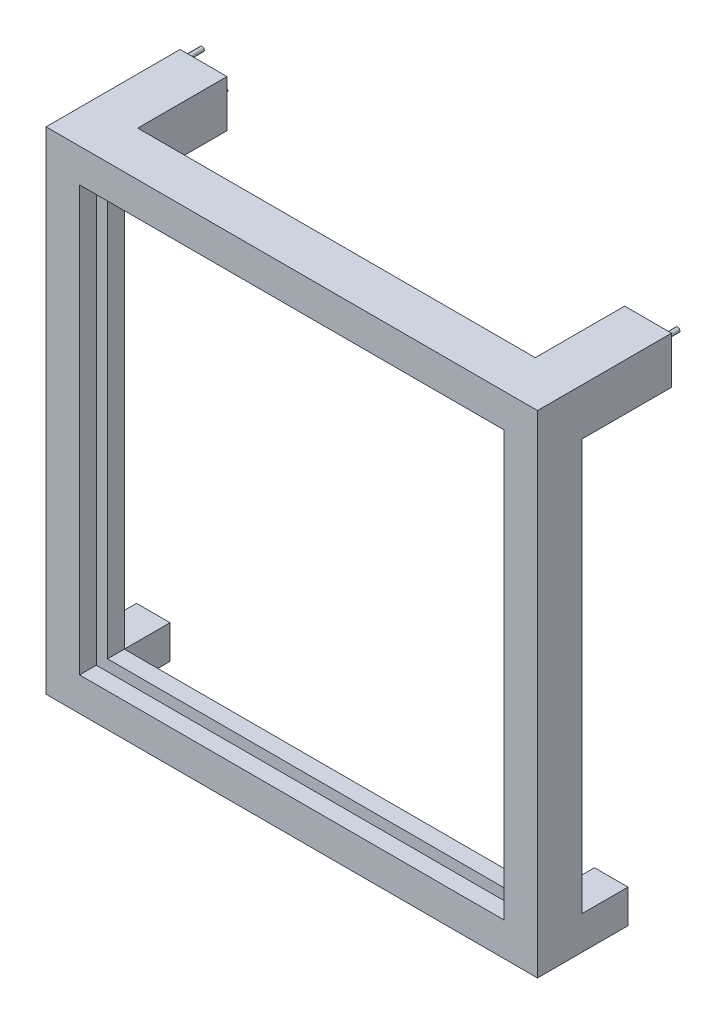
ISO-10303-21;
HEADER;
FILE_DESCRIPTION(('STEP AP214'),'2;1');
FILE_NAME('part.step','',(''),(''),'','','');
FILE_SCHEMA(('AUTOMOTIVE_DESIGN { 1 0 10303 214 1 1 1 1 }'));
ENDSEC;
DATA;
#1=APPLICATION_CONTEXT('core data for automotive mechanical design processes');
#2=APPLICATION_PROTOCOL_DEFINITION('international standard','automotive_design',2000,#1);
#3=PRODUCT_CONTEXT('',#1,'mechanical');
#4=PRODUCT('Part','Part','',(#3));
#5=PRODUCT_RELATED_PRODUCT_CATEGORY('part','',(#4));
#6=PRODUCT_DEFINITION_FORMATION('','',#4);
#7=PRODUCT_DEFINITION_CONTEXT('part definition',#1,'design');
#8=PRODUCT_DEFINITION('design','',#6,#7);
#9=PRODUCT_DEFINITION_SHAPE('','',#8);
#10=(LENGTH_UNIT() NAMED_UNIT(*) SI_UNIT(.MILLI.,.METRE.));
#11=(NAMED_UNIT(*) PLANE_ANGLE_UNIT() SI_UNIT($,.RADIAN.));
#12=(NAMED_UNIT(*) SI_UNIT($,.STERADIAN.) SOLID_ANGLE_UNIT());
#13=UNCERTAINTY_MEASURE_WITH_UNIT(LENGTH_MEASURE(1.E-05),#10,'distance_accuracy_value','');
#14=(GEOMETRIC_REPRESENTATION_CONTEXT(3) GLOBAL_UNCERTAINTY_ASSIGNED_CONTEXT((#13)) GLOBAL_UNIT_ASSIGNED_CONTEXT((#10,
#11,#12)) REPRESENTATION_CONTEXT('',''));
#15=CARTESIAN_POINT('',(0.,0.,0.));
#16=DIRECTION('',(0.,0.,1.));
#17=DIRECTION('',(1.,0.,0.));
#18=AXIS2_PLACEMENT_3D('',#15,#16,#17);
#19=CARTESIAN_POINT('',(0.,0.,0.));
#20=DIRECTION('',(0.,0.,-1.));
#21=DIRECTION('',(-1.,0.,0.));
#22=AXIS2_PLACEMENT_3D('',#19,#20,#21);
#23=PLANE('',#22);
#24=DIRECTION('',(1.,0.,0.));
#25=VECTOR('',#24,1.);
#26=CARTESIAN_POINT('',(-220.,-220.,0.));
#27=LINE('',#26,#25);
#28=CARTESIAN_POINT('',(-190.,-220.,0.));
#29=VERTEX_POINT('',#28);
#30=CARTESIAN_POINT('',(190.,-220.,0.));
#31=VERTEX_POINT('',#30);
#32=EDGE_CURVE('E254',#29,#31,#27,.T.);
#33=ORIENTED_EDGE('',*,*,#32,.F.);
#34=DIRECTION('',(0.,-1.,0.));
#35=VECTOR('',#34,1.);
#36=CARTESIAN_POINT('',(-190.,-190.,0.));
#37=LINE('',#36,#35);
#38=CARTESIAN_POINT('',(-190.,-190.,0.));
#39=VERTEX_POINT('',#38);
#40=EDGE_CURVE('E52',#39,#29,#37,.T.);
#41=ORIENTED_EDGE('',*,*,#40,.F.);
#42=DIRECTION('',(1.,0.,0.));
#43=VECTOR('',#42,1.);
#44=CARTESIAN_POINT('',(-190.,-190.,0.));
#45=LINE('',#44,#43);
#46=CARTESIAN_POINT('',(190.,-190.,0.));
#47=VERTEX_POINT('',#46);
#48=EDGE_CURVE('E253',#39,#47,#45,.T.);
#49=ORIENTED_EDGE('',*,*,#48,.T.);
#50=DIRECTION('',(0.,1.,0.));
#51=VECTOR('',#50,1.);
#52=CARTESIAN_POINT('',(190.,-220.,0.));
#53=LINE('',#52,#51);
#54=EDGE_CURVE('E255',#31,#47,#53,.T.);
#55=ORIENTED_EDGE('',*,*,#54,.F.);
#56=EDGE_LOOP('',(#33,#41,#49,#55));
#57=FACE_BOUND('',#56,.T.);
#58=ADVANCED_FACE('F37',(#57),#23,.T.);
#59=DIRECTION('',(0.,-1.,0.));
#60=VECTOR('',#59,1.);
#61=CARTESIAN_POINT('',(-190.,-190.,0.));
#62=LINE('',#61,#60);
#63=CARTESIAN_POINT('',(-190.,178.,0.));
#64=VERTEX_POINT('',#63);
#65=EDGE_CURVE('E259',#64,#39,#62,.T.);
#66=ORIENTED_EDGE('',*,*,#65,.T.);
#67=DIRECTION('',(1.,0.,0.));
#68=VECTOR('',#67,1.);
#69=CARTESIAN_POINT('',(-190.,-190.,0.));
#70=LINE('',#69,#68);
#71=CARTESIAN_POINT('',(-220.,-190.,0.));
#72=VERTEX_POINT('',#71);
#73=EDGE_CURVE('E232',#72,#39,#70,.T.);
#74=ORIENTED_EDGE('',*,*,#73,.F.);
#75=DIRECTION('',(0.,-1.,0.));
#76=VECTOR('',#75,1.);
#77=CARTESIAN_POINT('',(-220.,-220.,0.));
#78=LINE('',#77,#76);
#79=CARTESIAN_POINT('',(-220.,178.,0.));
#80=VERTEX_POINT('',#79);
#81=EDGE_CURVE('E316',#80,#72,#78,.T.);
#82=ORIENTED_EDGE('',*,*,#81,.F.);
#83=DIRECTION('',(-1.,0.,0.));
#84=VECTOR('',#83,1.);
#85=CARTESIAN_POINT('',(-220.,178.,0.));
#86=LINE('',#85,#84);
#87=EDGE_CURVE('E262',#64,#80,#86,.T.);
#88=ORIENTED_EDGE('',*,*,#87,.F.);
#89=EDGE_LOOP('',(#66,#74,#82,#88));
#90=FACE_BOUND('',#89,.T.);
#91=ADVANCED_FACE('F261',(#90),#23,.T.);
#92=DIRECTION('',(0.,1.,0.));
#93=VECTOR('',#92,1.);
#94=CARTESIAN_POINT('',(220.,-220.,0.));
#95=LINE('',#94,#93);
#96=CARTESIAN_POINT('',(220.,-190.,0.));
#97=VERTEX_POINT('',#96);
#98=CARTESIAN_POINT('',(220.,178.,0.));
#99=VERTEX_POINT('',#98);
#100=EDGE_CURVE('E301',#97,#99,#95,.T.);
#101=ORIENTED_EDGE('',*,*,#100,.F.);
#102=DIRECTION('',(1.,0.,0.));
#103=VECTOR('',#102,1.);
#104=CARTESIAN_POINT('',(220.,-190.,0.));
#105=LINE('',#104,#103);
#106=EDGE_CURVE('E426',#47,#97,#105,.T.);
#107=ORIENTED_EDGE('',*,*,#106,.F.);
#108=DIRECTION('',(0.,1.,0.));
#109=VECTOR('',#108,1.);
#110=CARTESIAN_POINT('',(190.,-190.,0.));
#111=LINE('',#110,#109);
#112=CARTESIAN_POINT('',(190.,178.,0.));
#113=VERTEX_POINT('',#112);
#114=EDGE_CURVE('E495',#47,#113,#111,.T.);
#115=ORIENTED_EDGE('',*,*,#114,.T.);
#116=DIRECTION('',(-1.,0.,0.));
#117=VECTOR('',#116,1.);
#118=CARTESIAN_POINT('',(220.,178.,0.));
#119=LINE('',#118,#117);
#120=EDGE_CURVE('E343',#99,#113,#119,.T.);
#121=ORIENTED_EDGE('',*,*,#120,.F.);
#122=EDGE_LOOP('',(#101,#107,#115,#121));
#123=FACE_BOUND('',#122,.T.);
#124=ADVANCED_FACE('F474',(#123),#23,.T.);
#125=DIRECTION('',(-1.,0.,0.));
#126=VECTOR('',#125,1.);
#127=CARTESIAN_POINT('',(-190.,190.,0.));
#128=LINE('',#127,#126);
#129=CARTESIAN_POINT('',(178.,190.,0.));
#130=VERTEX_POINT('',#129);
#131=CARTESIAN_POINT('',(-178.,190.,0.));
#132=VERTEX_POINT('',#131);
#133=EDGE_CURVE('E490',#130,#132,#128,.T.);
#134=ORIENTED_EDGE('',*,*,#133,.T.);
#135=DIRECTION('',(0.,-1.,0.));
#136=VECTOR('',#135,1.);
#137=CARTESIAN_POINT('',(-178.,220.,0.));
#138=LINE('',#137,#136);
#139=CARTESIAN_POINT('',(-178.,220.,0.));
#140=VERTEX_POINT('',#139);
#141=EDGE_CURVE('E364',#140,#132,#138,.T.);
#142=ORIENTED_EDGE('',*,*,#141,.F.);
#143=DIRECTION('',(-1.,0.,0.));
#144=VECTOR('',#143,1.);
#145=CARTESIAN_POINT('',(-220.,220.,0.));
#146=LINE('',#145,#144);
#147=CARTESIAN_POINT('',(178.,220.,0.));
#148=VERTEX_POINT('',#147);
#149=EDGE_CURVE('E313',#148,#140,#146,.T.);
#150=ORIENTED_EDGE('',*,*,#149,.F.);
#151=DIRECTION('',(0.,1.,0.));
#152=VECTOR('',#151,1.);
#153=CARTESIAN_POINT('',(178.,220.,0.));
#154=LINE('',#153,#152);
#155=EDGE_CURVE('E329',#130,#148,#154,.T.);
#156=ORIENTED_EDGE('',*,*,#155,.F.);
#157=EDGE_LOOP('',(#134,#142,#150,#156));
#158=FACE_BOUND('',#157,.T.);
#159=ADVANCED_FACE('F470',(#158),#23,.T.);
#160=CARTESIAN_POINT('',(190.,-190.,40.));
#161=DIRECTION('',(-1.,0.,0.));
#162=DIRECTION('',(0.,0.,1.));
#163=AXIS2_PLACEMENT_3D('',#160,#161,#162);
#164=PLANE('',#163);
#165=DIRECTION('',(0.,-1.,0.));
#166=VECTOR('',#165,1.);
#167=CARTESIAN_POINT('',(190.,-190.,15.));
#168=LINE('',#167,#166);
#169=CARTESIAN_POINT('',(190.,190.,15.));
#170=VERTEX_POINT('',#169);
#171=CARTESIAN_POINT('',(190.,-190.,15.));
#172=VERTEX_POINT('',#171);
#173=EDGE_CURVE('E505',#170,#172,#168,.T.);
#174=ORIENTED_EDGE('',*,*,#173,.F.);
#175=DIRECTION('',(0.,0.,-1.));
#176=VECTOR('',#175,1.);
#177=CARTESIAN_POINT('',(190.,190.,40.));
#178=LINE('',#177,#176);
#179=CARTESIAN_POINT('',(190.,190.,0.));
#180=VERTEX_POINT('',#179);
#181=EDGE_CURVE('E297',#170,#180,#178,.T.);
#182=ORIENTED_EDGE('',*,*,#181,.T.);
#183=EDGE_CURVE('E496',#113,#180,#111,.T.);
#184=ORIENTED_EDGE('',*,*,#183,.F.);
#185=ORIENTED_EDGE('',*,*,#114,.F.);
#186=DIRECTION('',(0.,0.,-1.));
#187=VECTOR('',#186,1.);
#188=CARTESIAN_POINT('',(190.,-190.,40.));
#189=LINE('',#188,#187);
#190=EDGE_CURVE('E282',#172,#47,#189,.T.);
#191=ORIENTED_EDGE('',*,*,#190,.F.);
#192=EDGE_LOOP('',(#174,#182,#184,#185,#191));
#193=FACE_BOUND('',#192,.T.);
#194=ADVANCED_FACE('F477',(#193),#164,.T.);
#195=CARTESIAN_POINT('',(-190.,190.,40.));
#196=DIRECTION('',(0.,-1.,0.));
#197=DIRECTION('',(0.,0.,-1.));
#198=AXIS2_PLACEMENT_3D('',#195,#196,#197);
#199=PLANE('',#198);
#200=DIRECTION('',(1.,0.,0.));
#201=VECTOR('',#200,1.);
#202=CARTESIAN_POINT('',(-190.,190.,15.));
#203=LINE('',#202,#201);
#204=CARTESIAN_POINT('',(-190.,190.,15.));
#205=VERTEX_POINT('',#204);
#206=EDGE_CURVE('E507',#205,#170,#203,.T.);
#207=ORIENTED_EDGE('',*,*,#206,.F.);
#208=DIRECTION('',(0.,0.,-1.));
#209=VECTOR('',#208,1.);
#210=CARTESIAN_POINT('',(-190.,190.,40.));
#211=LINE('',#210,#209);
#212=CARTESIAN_POINT('',(-190.,190.,0.));
#213=VERTEX_POINT('',#212);
#214=EDGE_CURVE('E293',#205,#213,#211,.T.);
#215=ORIENTED_EDGE('',*,*,#214,.T.);
#216=DIRECTION('',(-1.,0.,0.));
#217=VECTOR('',#216,1.);
#218=CARTESIAN_POINT('',(-190.,190.,0.));
#219=LINE('',#218,#217);
#220=EDGE_CURVE('E354',#132,#213,#219,.T.);
#221=ORIENTED_EDGE('',*,*,#220,.F.);
#222=ORIENTED_EDGE('',*,*,#133,.F.);
#223=EDGE_CURVE('E266',#180,#130,#128,.T.);
#224=ORIENTED_EDGE('',*,*,#223,.F.);
#225=ORIENTED_EDGE('',*,*,#181,.F.);
#226=EDGE_LOOP('',(#207,#215,#221,#222,#224,#225));
#227=FACE_BOUND('',#226,.T.);
#228=ADVANCED_FACE('F483',(#227),#199,.T.);
#229=CARTESIAN_POINT('',(-190.,-190.,40.));
#230=DIRECTION('',(1.,0.,0.));
#231=DIRECTION('',(0.,0.,-1.));
#232=AXIS2_PLACEMENT_3D('',#229,#230,#231);
#233=PLANE('',#232);
#234=DIRECTION('',(0.,1.,0.));
#235=VECTOR('',#234,1.);
#236=CARTESIAN_POINT('',(-190.,-190.,15.));
#237=LINE('',#236,#235);
#238=CARTESIAN_POINT('',(-190.,-190.,15.));
#239=VERTEX_POINT('',#238);
#240=EDGE_CURVE('E273',#239,#205,#237,.T.);
#241=ORIENTED_EDGE('',*,*,#240,.F.);
#242=DIRECTION('',(0.,0.,-1.));
#243=VECTOR('',#242,1.);
#244=CARTESIAN_POINT('',(-190.,-190.,40.));
#245=LINE('',#244,#243);
#246=EDGE_CURVE('E270',#239,#39,#245,.T.);
#247=ORIENTED_EDGE('',*,*,#246,.T.);
#248=ORIENTED_EDGE('',*,*,#65,.F.);
#249=EDGE_CURVE('E265',#213,#64,#62,.T.);
#250=ORIENTED_EDGE('',*,*,#249,.F.);
#251=ORIENTED_EDGE('',*,*,#214,.F.);
#252=EDGE_LOOP('',(#241,#247,#248,#250,#251));
#253=FACE_BOUND('',#252,.T.);
#254=ADVANCED_FACE('F271',(#253),#233,.T.);
#255=CARTESIAN_POINT('',(-190.,-190.,40.));
#256=DIRECTION('',(0.,1.,0.));
#257=DIRECTION('',(0.,0.,1.));
#258=AXIS2_PLACEMENT_3D('',#255,#256,#257);
#259=PLANE('',#258);
#260=DIRECTION('',(-1.,0.,0.));
#261=VECTOR('',#260,1.);
#262=CARTESIAN_POINT('',(-190.,-190.,15.));
#263=LINE('',#262,#261);
#264=EDGE_CURVE('E328',#172,#239,#263,.T.);
#265=ORIENTED_EDGE('',*,*,#264,.F.);
#266=ORIENTED_EDGE('',*,*,#190,.T.);
#267=ORIENTED_EDGE('',*,*,#48,.F.);
#268=ORIENTED_EDGE('',*,*,#246,.F.);
#269=EDGE_LOOP('',(#265,#266,#267,#268));
#270=FACE_BOUND('',#269,.T.);
#271=ADVANCED_FACE('F280',(#270),#259,.T.);
#272=CARTESIAN_POINT('',(0.,0.,40.));
#273=DIRECTION('',(0.,0.,-1.));
#274=DIRECTION('',(-1.,0.,0.));
#275=AXIS2_PLACEMENT_3D('',#272,#273,#274);
#276=PLANE('',#275);
#277=DIRECTION('',(0.,1.,0.));
#278=VECTOR('',#277,1.);
#279=CARTESIAN_POINT('',(220.,-220.,40.));
#280=LINE('',#279,#278);
#281=CARTESIAN_POINT('',(220.,-220.,40.));
#282=VERTEX_POINT('',#281);
#283=CARTESIAN_POINT('',(220.,220.,40.));
#284=VERTEX_POINT('',#283);
#285=EDGE_CURVE('E302',#282,#284,#280,.T.);
#286=ORIENTED_EDGE('',*,*,#285,.T.);
#287=DIRECTION('',(-1.,0.,0.));
#288=VECTOR('',#287,1.);
#289=CARTESIAN_POINT('',(-220.,220.,40.));
#290=LINE('',#289,#288);
#291=CARTESIAN_POINT('',(-220.,220.,40.));
#292=VERTEX_POINT('',#291);
#293=EDGE_CURVE('E305',#284,#292,#290,.T.);
#294=ORIENTED_EDGE('',*,*,#293,.T.);
#295=DIRECTION('',(0.,-1.,0.));
#296=VECTOR('',#295,1.);
#297=CARTESIAN_POINT('',(-220.,-220.,40.));
#298=LINE('',#297,#296);
#299=CARTESIAN_POINT('',(-220.,-220.,40.));
#300=VERTEX_POINT('',#299);
#301=EDGE_CURVE('E307',#292,#300,#298,.T.);
#302=ORIENTED_EDGE('',*,*,#301,.T.);
#303=DIRECTION('',(1.,0.,0.));
#304=VECTOR('',#303,1.);
#305=CARTESIAN_POINT('',(-220.,-220.,40.));
#306=LINE('',#305,#304);
#307=EDGE_CURVE('E309',#300,#282,#306,.T.);
#308=ORIENTED_EDGE('',*,*,#307,.T.);
#309=EDGE_LOOP('',(#286,#294,#302,#308));
#310=FACE_BOUND('',#309,.T.);
#311=DIRECTION('',(0.,1.,0.));
#312=VECTOR('',#311,1.);
#313=CARTESIAN_POINT('',(190.,-190.,40.));
#314=LINE('',#313,#312);
#315=CARTESIAN_POINT('',(190.,-190.,40.));
#316=VERTEX_POINT('',#315);
#317=CARTESIAN_POINT('',(190.,190.,40.));
#318=VERTEX_POINT('',#317);
#319=EDGE_CURVE('E284',#316,#318,#314,.T.);
#320=ORIENTED_EDGE('',*,*,#319,.F.);
#321=DIRECTION('',(1.,0.,0.));
#322=VECTOR('',#321,1.);
#323=CARTESIAN_POINT('',(-190.,-190.,40.));
#324=LINE('',#323,#322);
#325=CARTESIAN_POINT('',(-190.,-190.,40.));
#326=VERTEX_POINT('',#325);
#327=EDGE_CURVE('E499',#326,#316,#324,.T.);
#328=ORIENTED_EDGE('',*,*,#327,.F.);
#329=DIRECTION('',(0.,-1.,0.));
#330=VECTOR('',#329,1.);
#331=CARTESIAN_POINT('',(-190.,-190.,40.));
#332=LINE('',#331,#330);
#333=CARTESIAN_POINT('',(-190.,190.,40.));
#334=VERTEX_POINT('',#333);
#335=EDGE_CURVE('E501',#334,#326,#332,.T.);
#336=ORIENTED_EDGE('',*,*,#335,.F.);
#337=DIRECTION('',(-1.,0.,0.));
#338=VECTOR('',#337,1.);
#339=CARTESIAN_POINT('',(-190.,190.,40.));
#340=LINE('',#339,#338);
#341=EDGE_CURVE('E286',#318,#334,#340,.T.);
#342=ORIENTED_EDGE('',*,*,#341,.F.);
#343=EDGE_LOOP('',(#320,#328,#336,#342));
#344=FACE_BOUND('',#343,.T.);
#345=ADVANCED_FACE('F618',(#310,#344),#276,.F.);
#346=CARTESIAN_POINT('',(220.,-220.,40.));
#347=DIRECTION('',(-1.,0.,0.));
#348=DIRECTION('',(0.,0.,1.));
#349=AXIS2_PLACEMENT_3D('',#346,#347,#348);
#350=PLANE('',#349);
#351=DIRECTION('',(0.,0.,-1.));
#352=VECTOR('',#351,1.);
#353=CARTESIAN_POINT('',(220.,-220.,40.));
#354=LINE('',#353,#352);
#355=CARTESIAN_POINT('',(220.,-220.,-41.));
#356=VERTEX_POINT('',#355);
#357=EDGE_CURVE('E311',#282,#356,#354,.T.);
#358=ORIENTED_EDGE('',*,*,#357,.T.);
#359=DIRECTION('',(0.,-1.,0.));
#360=VECTOR('',#359,1.);
#361=CARTESIAN_POINT('',(220.,-220.,-41.));
#362=LINE('',#361,#360);
#363=CARTESIAN_POINT('',(220.,-190.,-41.));
#364=VERTEX_POINT('',#363);
#365=EDGE_CURVE('E428',#364,#356,#362,.T.);
#366=ORIENTED_EDGE('',*,*,#365,.F.);
#367=DIRECTION('',(0.,0.,1.));
#368=VECTOR('',#367,1.);
#369=CARTESIAN_POINT('',(220.,-190.,-41.));
#370=LINE('',#369,#368);
#371=EDGE_CURVE('E422',#364,#97,#370,.T.);
#372=ORIENTED_EDGE('',*,*,#371,.T.);
#373=ORIENTED_EDGE('',*,*,#100,.T.);
#374=DIRECTION('',(0.,0.,1.));
#375=VECTOR('',#374,1.);
#376=CARTESIAN_POINT('',(220.,178.,-80.));
#377=LINE('',#376,#375);
#378=CARTESIAN_POINT('',(220.,178.,-80.));
#379=VERTEX_POINT('',#378);
#380=EDGE_CURVE('E548',#379,#99,#377,.T.);
#381=ORIENTED_EDGE('',*,*,#380,.F.);
#382=DIRECTION('',(0.,-1.,0.));
#383=VECTOR('',#382,1.);
#384=CARTESIAN_POINT('',(220.,220.,-80.));
#385=LINE('',#384,#383);
#386=CARTESIAN_POINT('',(220.,220.,-80.));
#387=VERTEX_POINT('',#386);
#388=EDGE_CURVE('E342',#387,#379,#385,.T.);
#389=ORIENTED_EDGE('',*,*,#388,.F.);
#390=DIRECTION('',(0.,0.,-1.));
#391=VECTOR('',#390,1.);
#392=CARTESIAN_POINT('',(220.,220.,40.));
#393=LINE('',#392,#391);
#394=EDGE_CURVE('E324',#284,#387,#393,.T.);
#395=ORIENTED_EDGE('',*,*,#394,.F.);
#396=ORIENTED_EDGE('',*,*,#285,.F.);
#397=EDGE_LOOP('',(#358,#366,#372,#373,#381,#389,#395,#396));
#398=FACE_BOUND('',#397,.T.);
#399=ADVANCED_FACE('F39',(#398),#350,.F.);
#400=CARTESIAN_POINT('',(-220.,220.,40.));
#401=DIRECTION('',(0.,-1.,0.));
#402=DIRECTION('',(0.,0.,-1.));
#403=AXIS2_PLACEMENT_3D('',#400,#401,#402);
#404=PLANE('',#403);
#405=ORIENTED_EDGE('',*,*,#394,.T.);
#406=DIRECTION('',(1.,0.,0.));
#407=VECTOR('',#406,1.);
#408=CARTESIAN_POINT('',(220.,220.,-80.));
#409=LINE('',#408,#407);
#410=CARTESIAN_POINT('',(178.,220.,-80.));
#411=VERTEX_POINT('',#410);
#412=EDGE_CURVE('E356',#411,#387,#409,.T.);
#413=ORIENTED_EDGE('',*,*,#412,.F.);
#414=DIRECTION('',(0.,0.,1.));
#415=VECTOR('',#414,1.);
#416=CARTESIAN_POINT('',(178.,220.,-80.));
#417=LINE('',#416,#415);
#418=EDGE_CURVE('E359',#411,#148,#417,.T.);
#419=ORIENTED_EDGE('',*,*,#418,.T.);
#420=ORIENTED_EDGE('',*,*,#149,.T.);
#421=DIRECTION('',(0.,0.,1.));
#422=VECTOR('',#421,1.);
#423=CARTESIAN_POINT('',(-178.,220.,-80.));
#424=LINE('',#423,#422);
#425=CARTESIAN_POINT('',(-178.,220.,-80.));
#426=VERTEX_POINT('',#425);
#427=EDGE_CURVE('E384',#426,#140,#424,.T.);
#428=ORIENTED_EDGE('',*,*,#427,.F.);
#429=DIRECTION('',(1.,0.,0.));
#430=VECTOR('',#429,1.);
#431=CARTESIAN_POINT('',(-220.,220.,-80.));
#432=LINE('',#431,#430);
#433=CARTESIAN_POINT('',(-220.,220.,-80.));
#434=VERTEX_POINT('',#433);
#435=EDGE_CURVE('E368',#434,#426,#432,.T.);
#436=ORIENTED_EDGE('',*,*,#435,.F.);
#437=DIRECTION('',(0.,0.,-1.));
#438=VECTOR('',#437,1.);
#439=CARTESIAN_POINT('',(-220.,220.,40.));
#440=LINE('',#439,#438);
#441=EDGE_CURVE('E322',#292,#434,#440,.T.);
#442=ORIENTED_EDGE('',*,*,#441,.F.);
#443=ORIENTED_EDGE('',*,*,#293,.F.);
#444=EDGE_LOOP('',(#405,#413,#419,#420,#428,#436,#442,#443));
#445=FACE_BOUND('',#444,.T.);
#446=ADVANCED_FACE('F459',(#445),#404,.F.);
#447=CARTESIAN_POINT('',(-220.,-220.,40.));
#448=DIRECTION('',(1.,0.,0.));
#449=DIRECTION('',(0.,0.,-1.));
#450=AXIS2_PLACEMENT_3D('',#447,#448,#449);
#451=PLANE('',#450);
#452=ORIENTED_EDGE('',*,*,#441,.T.);
#453=DIRECTION('',(0.,1.,0.));
#454=VECTOR('',#453,1.);
#455=CARTESIAN_POINT('',(-220.,220.,-80.));
#456=LINE('',#455,#454);
#457=CARTESIAN_POINT('',(-220.,178.,-80.));
#458=VERTEX_POINT('',#457);
#459=EDGE_CURVE('E365',#458,#434,#456,.T.);
#460=ORIENTED_EDGE('',*,*,#459,.F.);
#461=DIRECTION('',(0.,0.,1.));
#462=VECTOR('',#461,1.);
#463=CARTESIAN_POINT('',(-220.,178.,-80.));
#464=LINE('',#463,#462);
#465=EDGE_CURVE('E60',#458,#80,#464,.T.);
#466=ORIENTED_EDGE('',*,*,#465,.T.);
#467=ORIENTED_EDGE('',*,*,#81,.T.);
#468=DIRECTION('',(0.,0.,1.));
#469=VECTOR('',#468,1.);
#470=CARTESIAN_POINT('',(-220.,-190.,-41.));
#471=LINE('',#470,#469);
#472=CARTESIAN_POINT('',(-220.,-190.,-41.));
#473=VERTEX_POINT('',#472);
#474=EDGE_CURVE('E238',#473,#72,#471,.T.);
#475=ORIENTED_EDGE('',*,*,#474,.F.);
#476=DIRECTION('',(0.,1.,0.));
#477=VECTOR('',#476,1.);
#478=CARTESIAN_POINT('',(-220.,-190.,-41.));
#479=LINE('',#478,#477);
#480=CARTESIAN_POINT('',(-220.,-220.,-41.));
#481=VERTEX_POINT('',#480);
#482=EDGE_CURVE('E441',#481,#473,#479,.T.);
#483=ORIENTED_EDGE('',*,*,#482,.F.);
#484=DIRECTION('',(0.,0.,-1.));
#485=VECTOR('',#484,1.);
#486=CARTESIAN_POINT('',(-220.,-220.,40.));
#487=LINE('',#486,#485);
#488=EDGE_CURVE('E320',#300,#481,#487,.T.);
#489=ORIENTED_EDGE('',*,*,#488,.F.);
#490=ORIENTED_EDGE('',*,*,#301,.F.);
#491=EDGE_LOOP('',(#452,#460,#466,#467,#475,#483,#489,#490));
#492=FACE_BOUND('',#491,.T.);
#493=ADVANCED_FACE('F454',(#492),#451,.F.);
#494=CARTESIAN_POINT('',(-220.,-220.,40.));
#495=DIRECTION('',(0.,1.,0.));
#496=DIRECTION('',(0.,0.,1.));
#497=AXIS2_PLACEMENT_3D('',#494,#495,#496);
#498=PLANE('',#497);
#499=ORIENTED_EDGE('',*,*,#488,.T.);
#500=DIRECTION('',(-1.,0.,0.));
#501=VECTOR('',#500,1.);
#502=CARTESIAN_POINT('',(-190.,-220.,-41.));
#503=LINE('',#502,#501);
#504=CARTESIAN_POINT('',(-190.,-220.,-41.));
#505=VERTEX_POINT('',#504);
#506=EDGE_CURVE('E438',#505,#481,#503,.T.);
#507=ORIENTED_EDGE('',*,*,#506,.F.);
#508=DIRECTION('',(0.,0.,1.));
#509=VECTOR('',#508,1.);
#510=CARTESIAN_POINT('',(-190.,-220.,-41.));
#511=LINE('',#510,#509);
#512=EDGE_CURVE('E445',#505,#29,#511,.T.);
#513=ORIENTED_EDGE('',*,*,#512,.T.);
#514=ORIENTED_EDGE('',*,*,#32,.T.);
#515=DIRECTION('',(0.,0.,1.));
#516=VECTOR('',#515,1.);
#517=CARTESIAN_POINT('',(190.,-220.,-41.));
#518=LINE('',#517,#516);
#519=CARTESIAN_POINT('',(190.,-220.,-41.));
#520=VERTEX_POINT('',#519);
#521=EDGE_CURVE('E409',#520,#31,#518,.T.);
#522=ORIENTED_EDGE('',*,*,#521,.F.);
#523=DIRECTION('',(-1.,0.,0.));
#524=VECTOR('',#523,1.);
#525=CARTESIAN_POINT('',(220.,-220.,-41.));
#526=LINE('',#525,#524);
#527=EDGE_CURVE('E433',#356,#520,#526,.T.);
#528=ORIENTED_EDGE('',*,*,#527,.F.);
#529=ORIENTED_EDGE('',*,*,#357,.F.);
#530=ORIENTED_EDGE('',*,*,#307,.F.);
#531=EDGE_LOOP('',(#499,#507,#513,#514,#522,#528,#529,#530));
#532=FACE_BOUND('',#531,.T.);
#533=ADVANCED_FACE('F447',(#532),#498,.F.);
#534=DIRECTION('',(0.,1.,0.));
#535=VECTOR('',#534,1.);
#536=CARTESIAN_POINT('',(190.,-190.,25.));
#537=LINE('',#536,#535);
#538=CARTESIAN_POINT('',(190.,-190.,25.));
#539=VERTEX_POINT('',#538);
#540=CARTESIAN_POINT('',(190.,190.,25.));
#541=VERTEX_POINT('',#540);
#542=EDGE_CURVE('E510',#539,#541,#537,.T.);
#543=ORIENTED_EDGE('',*,*,#542,.F.);
#544=EDGE_CURVE('E277',#316,#539,#189,.T.);
#545=ORIENTED_EDGE('',*,*,#544,.F.);
#546=ORIENTED_EDGE('',*,*,#319,.T.);
#547=EDGE_CURVE('E298',#318,#541,#178,.T.);
#548=ORIENTED_EDGE('',*,*,#547,.T.);
#549=EDGE_LOOP('',(#543,#545,#546,#548));
#550=FACE_BOUND('',#549,.T.);
#551=ADVANCED_FACE('F465',(#550),#164,.T.);
#552=DIRECTION('',(-1.,0.,0.));
#553=VECTOR('',#552,1.);
#554=CARTESIAN_POINT('',(-190.,190.,25.));
#555=LINE('',#554,#553);
#556=CARTESIAN_POINT('',(-190.,190.,25.));
#557=VERTEX_POINT('',#556);
#558=EDGE_CURVE('E512',#541,#557,#555,.T.);
#559=ORIENTED_EDGE('',*,*,#558,.F.);
#560=ORIENTED_EDGE('',*,*,#547,.F.);
#561=ORIENTED_EDGE('',*,*,#341,.T.);
#562=EDGE_CURVE('E294',#334,#557,#211,.T.);
#563=ORIENTED_EDGE('',*,*,#562,.T.);
#564=EDGE_LOOP('',(#559,#560,#561,#563));
#565=FACE_BOUND('',#564,.T.);
#566=ADVANCED_FACE('F612',(#565),#199,.T.);
#567=DIRECTION('',(0.,-1.,0.));
#568=VECTOR('',#567,1.);
#569=CARTESIAN_POINT('',(-190.,-190.,25.));
#570=LINE('',#569,#568);
#571=CARTESIAN_POINT('',(-190.,-190.,25.));
#572=VERTEX_POINT('',#571);
#573=EDGE_CURVE('E514',#557,#572,#570,.T.);
#574=ORIENTED_EDGE('',*,*,#573,.F.);
#575=ORIENTED_EDGE('',*,*,#562,.F.);
#576=ORIENTED_EDGE('',*,*,#335,.T.);
#577=EDGE_CURVE('E276',#326,#572,#245,.T.);
#578=ORIENTED_EDGE('',*,*,#577,.T.);
#579=EDGE_LOOP('',(#574,#575,#576,#578));
#580=FACE_BOUND('',#579,.T.);
#581=ADVANCED_FACE('F608',(#580),#233,.T.);
#582=DIRECTION('',(1.,0.,0.));
#583=VECTOR('',#582,1.);
#584=CARTESIAN_POINT('',(-190.,-190.,25.));
#585=LINE('',#584,#583);
#586=EDGE_CURVE('E326',#572,#539,#585,.T.);
#587=ORIENTED_EDGE('',*,*,#586,.F.);
#588=ORIENTED_EDGE('',*,*,#577,.F.);
#589=ORIENTED_EDGE('',*,*,#327,.T.);
#590=ORIENTED_EDGE('',*,*,#544,.T.);
#591=EDGE_LOOP('',(#587,#588,#589,#590));
#592=FACE_BOUND('',#591,.T.);
#593=ADVANCED_FACE('F605',(#592),#259,.T.);
#594=CARTESIAN_POINT('',(-200.,-200.,25.));
#595=DIRECTION('',(-1.,0.,0.));
#596=DIRECTION('',(0.,0.,1.));
#597=AXIS2_PLACEMENT_3D('',#594,#595,#596);
#598=PLANE('',#597);
#599=DIRECTION('',(0.,1.,0.));
#600=VECTOR('',#599,1.);
#601=CARTESIAN_POINT('',(-200.,-200.,25.));
#602=LINE('',#601,#600);
#603=CARTESIAN_POINT('',(-200.,-200.,25.));
#604=VERTEX_POINT('',#603);
#605=CARTESIAN_POINT('',(-200.,200.,25.));
#606=VERTEX_POINT('',#605);
#607=EDGE_CURVE('E517',#604,#606,#602,.T.);
#608=ORIENTED_EDGE('',*,*,#607,.F.);
#609=DIRECTION('',(0.,0.,1.));
#610=VECTOR('',#609,1.);
#611=CARTESIAN_POINT('',(-200.,-200.,25.));
#612=LINE('',#611,#610);
#613=CARTESIAN_POINT('',(-200.,-200.,15.));
#614=VERTEX_POINT('',#613);
#615=EDGE_CURVE('E533',#614,#604,#612,.T.);
#616=ORIENTED_EDGE('',*,*,#615,.F.);
#617=DIRECTION('',(0.,1.,0.));
#618=VECTOR('',#617,1.);
#619=CARTESIAN_POINT('',(-200.,-200.,15.));
#620=LINE('',#619,#618);
#621=CARTESIAN_POINT('',(-200.,200.,15.));
#622=VERTEX_POINT('',#621);
#623=EDGE_CURVE('E516',#614,#622,#620,.T.);
#624=ORIENTED_EDGE('',*,*,#623,.T.);
#625=DIRECTION('',(0.,0.,1.));
#626=VECTOR('',#625,1.);
#627=CARTESIAN_POINT('',(-200.,200.,25.));
#628=LINE('',#627,#626);
#629=EDGE_CURVE('E545',#622,#606,#628,.T.);
#630=ORIENTED_EDGE('',*,*,#629,.T.);
#631=EDGE_LOOP('',(#608,#616,#624,#630));
#632=FACE_BOUND('',#631,.T.);
#633=ADVANCED_FACE('F575',(#632),#598,.F.);
#634=CARTESIAN_POINT('',(-200.,-200.,15.));
#635=DIRECTION('',(0.,0.,-1.));
#636=DIRECTION('',(-1.,0.,0.));
#637=AXIS2_PLACEMENT_3D('',#634,#635,#636);
#638=PLANE('',#637);
#639=ORIENTED_EDGE('',*,*,#173,.T.);
#640=ORIENTED_EDGE('',*,*,#264,.T.);
#641=ORIENTED_EDGE('',*,*,#240,.T.);
#642=ORIENTED_EDGE('',*,*,#206,.T.);
#643=EDGE_LOOP('',(#639,#640,#641,#642));
#644=FACE_BOUND('',#643,.T.);
#645=ORIENTED_EDGE('',*,*,#623,.F.);
#646=DIRECTION('',(-1.,0.,0.));
#647=VECTOR('',#646,1.);
#648=CARTESIAN_POINT('',(-200.,-200.,15.));
#649=LINE('',#648,#647);
#650=CARTESIAN_POINT('',(200.,-200.,15.));
#651=VERTEX_POINT('',#650);
#652=EDGE_CURVE('E520',#651,#614,#649,.T.);
#653=ORIENTED_EDGE('',*,*,#652,.F.);
#654=DIRECTION('',(0.,1.,0.));
#655=VECTOR('',#654,1.);
#656=CARTESIAN_POINT('',(200.,-200.,15.));
#657=LINE('',#656,#655);
#658=CARTESIAN_POINT('',(200.,200.,15.));
#659=VERTEX_POINT('',#658);
#660=EDGE_CURVE('E522',#651,#659,#657,.T.);
#661=ORIENTED_EDGE('',*,*,#660,.T.);
#662=DIRECTION('',(-1.,0.,0.));
#663=VECTOR('',#662,1.);
#664=CARTESIAN_POINT('',(-200.,200.,15.));
#665=LINE('',#664,#663);
#666=EDGE_CURVE('E536',#659,#622,#665,.T.);
#667=ORIENTED_EDGE('',*,*,#666,.T.);
#668=EDGE_LOOP('',(#645,#653,#661,#667));
#669=FACE_BOUND('',#668,.T.);
#670=ADVANCED_FACE('F571',(#644,#669),#638,.F.);
#671=CARTESIAN_POINT('',(200.,-200.,25.));
#672=DIRECTION('',(1.,0.,0.));
#673=DIRECTION('',(0.,0.,-1.));
#674=AXIS2_PLACEMENT_3D('',#671,#672,#673);
#675=PLANE('',#674);
#676=ORIENTED_EDGE('',*,*,#660,.F.);
#677=DIRECTION('',(0.,0.,-1.));
#678=VECTOR('',#677,1.);
#679=CARTESIAN_POINT('',(200.,-200.,25.));
#680=LINE('',#679,#678);
#681=CARTESIAN_POINT('',(200.,-200.,25.));
#682=VERTEX_POINT('',#681);
#683=EDGE_CURVE('E527',#682,#651,#680,.T.);
#684=ORIENTED_EDGE('',*,*,#683,.F.);
#685=DIRECTION('',(0.,1.,0.));
#686=VECTOR('',#685,1.);
#687=CARTESIAN_POINT('',(200.,-200.,25.));
#688=LINE('',#687,#686);
#689=CARTESIAN_POINT('',(200.,200.,25.));
#690=VERTEX_POINT('',#689);
#691=EDGE_CURVE('E519',#682,#690,#688,.T.);
#692=ORIENTED_EDGE('',*,*,#691,.T.);
#693=DIRECTION('',(0.,0.,-1.));
#694=VECTOR('',#693,1.);
#695=CARTESIAN_POINT('',(200.,200.,25.));
#696=LINE('',#695,#694);
#697=EDGE_CURVE('E539',#690,#659,#696,.T.);
#698=ORIENTED_EDGE('',*,*,#697,.T.);
#699=EDGE_LOOP('',(#676,#684,#692,#698));
#700=FACE_BOUND('',#699,.T.);
#701=ADVANCED_FACE('F574',(#700),#675,.F.);
#702=CARTESIAN_POINT('',(-200.,-200.,25.));
#703=DIRECTION('',(0.,0.,1.));
#704=DIRECTION('',(1.,0.,0.));
#705=AXIS2_PLACEMENT_3D('',#702,#703,#704);
#706=PLANE('',#705);
#707=ORIENTED_EDGE('',*,*,#542,.T.);
#708=ORIENTED_EDGE('',*,*,#558,.T.);
#709=ORIENTED_EDGE('',*,*,#573,.T.);
#710=ORIENTED_EDGE('',*,*,#586,.T.);
#711=EDGE_LOOP('',(#707,#708,#709,#710));
#712=FACE_BOUND('',#711,.T.);
#713=ORIENTED_EDGE('',*,*,#691,.F.);
#714=DIRECTION('',(1.,0.,0.));
#715=VECTOR('',#714,1.);
#716=CARTESIAN_POINT('',(-200.,-200.,25.));
#717=LINE('',#716,#715);
#718=EDGE_CURVE('E530',#604,#682,#717,.T.);
#719=ORIENTED_EDGE('',*,*,#718,.F.);
#720=ORIENTED_EDGE('',*,*,#607,.T.);
#721=DIRECTION('',(1.,0.,0.));
#722=VECTOR('',#721,1.);
#723=CARTESIAN_POINT('',(-200.,200.,25.));
#724=LINE('',#723,#722);
#725=EDGE_CURVE('E542',#606,#690,#724,.T.);
#726=ORIENTED_EDGE('',*,*,#725,.T.);
#727=EDGE_LOOP('',(#713,#719,#720,#726));
#728=FACE_BOUND('',#727,.T.);
#729=ADVANCED_FACE('F592',(#712,#728),#706,.F.);
#730=CARTESIAN_POINT('',(0.,-200.,0.));
#731=DIRECTION('',(0.,-1.,0.));
#732=DIRECTION('',(0.,0.,-1.));
#733=AXIS2_PLACEMENT_3D('',#730,#731,#732);
#734=PLANE('',#733);
#735=ORIENTED_EDGE('',*,*,#615,.T.);
#736=ORIENTED_EDGE('',*,*,#718,.T.);
#737=ORIENTED_EDGE('',*,*,#683,.T.);
#738=ORIENTED_EDGE('',*,*,#652,.T.);
#739=EDGE_LOOP('',(#735,#736,#737,#738));
#740=FACE_BOUND('',#739,.T.);
#741=ADVANCED_FACE('F584',(#740),#734,.F.);
#742=CARTESIAN_POINT('',(0.,200.,0.));
#743=DIRECTION('',(0.,-1.,0.));
#744=DIRECTION('',(0.,0.,-1.));
#745=AXIS2_PLACEMENT_3D('',#742,#743,#744);
#746=PLANE('',#745);
#747=ORIENTED_EDGE('',*,*,#629,.F.);
#748=ORIENTED_EDGE('',*,*,#666,.F.);
#749=ORIENTED_EDGE('',*,*,#697,.F.);
#750=ORIENTED_EDGE('',*,*,#725,.F.);
#751=EDGE_LOOP('',(#747,#748,#749,#750));
#752=FACE_BOUND('',#751,.T.);
#753=ADVANCED_FACE('F590',(#752),#746,.T.);
#754=CARTESIAN_POINT('',(0.,0.,0.));
#755=DIRECTION('',(0.,0.,-1.));
#756=DIRECTION('',(-1.,0.,0.));
#757=AXIS2_PLACEMENT_3D('',#754,#755,#756);
#758=PLANE('',#757);
#759=CARTESIAN_POINT('',(178.,178.,0.));
#760=VERTEX_POINT('',#759);
#761=EDGE_CURVE('E350',#113,#760,#119,.T.);
#762=ORIENTED_EDGE('',*,*,#761,.F.);
#763=ORIENTED_EDGE('',*,*,#183,.T.);
#764=ORIENTED_EDGE('',*,*,#223,.T.);
#765=EDGE_CURVE('E335',#760,#130,#154,.T.);
#766=ORIENTED_EDGE('',*,*,#765,.F.);
#767=EDGE_LOOP('',(#762,#763,#764,#766));
#768=FACE_BOUND('',#767,.T.);
#769=ADVANCED_FACE('F564',(#768),#758,.F.);
#770=CARTESIAN_POINT('',(220.,178.,-80.));
#771=DIRECTION('',(0.,1.,0.));
#772=DIRECTION('',(0.,0.,1.));
#773=AXIS2_PLACEMENT_3D('',#770,#771,#772);
#774=PLANE('',#773);
#775=CARTESIAN_POINT('',(199.,178.,-60.5));
#776=DIRECTION('',(0.,-1.,0.));
#777=DIRECTION('',(0.,0.,-1.));
#778=AXIS2_PLACEMENT_3D('',#775,#776,#777);
#779=CIRCLE('',#778,3.99999999999982);
#780=CARTESIAN_POINT('',(199.,178.,-64.4999999999998));
#781=VERTEX_POINT('',#780);
#782=EDGE_CURVE('E412',#781,#781,#779,.T.);
#783=ORIENTED_EDGE('',*,*,#782,.F.);
#784=EDGE_LOOP('',(#783));
#785=FACE_BOUND('',#784,.T.);
#786=ORIENTED_EDGE('',*,*,#120,.T.);
#787=ORIENTED_EDGE('',*,*,#761,.T.);
#788=DIRECTION('',(0.,0.,1.));
#789=VECTOR('',#788,1.);
#790=CARTESIAN_POINT('',(178.,178.,-80.));
#791=LINE('',#790,#789);
#792=CARTESIAN_POINT('',(178.,178.,-80.));
#793=VERTEX_POINT('',#792);
#794=EDGE_CURVE('E550',#793,#760,#791,.T.);
#795=ORIENTED_EDGE('',*,*,#794,.F.);
#796=DIRECTION('',(-1.,0.,0.));
#797=VECTOR('',#796,1.);
#798=CARTESIAN_POINT('',(220.,178.,-80.));
#799=LINE('',#798,#797);
#800=EDGE_CURVE('E347',#379,#793,#799,.T.);
#801=ORIENTED_EDGE('',*,*,#800,.F.);
#802=ORIENTED_EDGE('',*,*,#380,.T.);
#803=EDGE_LOOP('',(#786,#787,#795,#801,#802));
#804=FACE_BOUND('',#803,.T.);
#805=ADVANCED_FACE('F560',(#785,#804),#774,.F.);
#806=CARTESIAN_POINT('',(178.,220.,-80.));
#807=DIRECTION('',(1.,0.,0.));
#808=DIRECTION('',(0.,0.,-1.));
#809=AXIS2_PLACEMENT_3D('',#806,#807,#808);
#810=PLANE('',#809);
#811=ORIENTED_EDGE('',*,*,#765,.T.);
#812=ORIENTED_EDGE('',*,*,#155,.T.);
#813=ORIENTED_EDGE('',*,*,#418,.F.);
#814=DIRECTION('',(0.,1.,0.));
#815=VECTOR('',#814,1.);
#816=CARTESIAN_POINT('',(178.,220.,-80.));
#817=LINE('',#816,#815);
#818=EDGE_CURVE('E360',#793,#411,#817,.T.);
#819=ORIENTED_EDGE('',*,*,#818,.F.);
#820=ORIENTED_EDGE('',*,*,#794,.T.);
#821=EDGE_LOOP('',(#811,#812,#813,#819,#820));
#822=FACE_BOUND('',#821,.T.);
#823=ADVANCED_FACE('F554',(#822),#810,.F.);
#824=CARTESIAN_POINT('',(0.,0.,-80.));
#825=DIRECTION('',(0.,0.,-1.));
#826=DIRECTION('',(-1.,0.,0.));
#827=AXIS2_PLACEMENT_3D('',#824,#825,#826);
#828=PLANE('',#827);
#829=CARTESIAN_POINT('',(189.505010617827,189.505010617827,-80.));
#830=DIRECTION('',(0.,0.,-1.));
#831=DIRECTION('',(-1.,0.,0.));
#832=AXIS2_PLACEMENT_3D('',#829,#830,#831);
#833=CIRCLE('',#832,2.);
#834=CARTESIAN_POINT('',(187.505010617827,189.505010617827,-80.));
#835=VERTEX_POINT('',#834);
#836=EDGE_CURVE('E390',#835,#835,#833,.T.);
#837=ORIENTED_EDGE('',*,*,#836,.F.);
#838=EDGE_LOOP('',(#837));
#839=FACE_BOUND('',#838,.T.);
#840=CARTESIAN_POINT('',(210.505010617827,210.505010617827,-80.));
#841=DIRECTION('',(0.,0.,-1.));
#842=DIRECTION('',(-1.,0.,0.));
#843=AXIS2_PLACEMENT_3D('',#840,#841,#842);
#844=CIRCLE('',#843,2.);
#845=CARTESIAN_POINT('',(208.505010617827,210.505010617827,-80.));
#846=VERTEX_POINT('',#845);
#847=EDGE_CURVE('E387',#846,#846,#844,.T.);
#848=ORIENTED_EDGE('',*,*,#847,.F.);
#849=EDGE_LOOP('',(#848));
#850=FACE_BOUND('',#849,.T.);
#851=ORIENTED_EDGE('',*,*,#388,.T.);
#852=ORIENTED_EDGE('',*,*,#800,.T.);
#853=ORIENTED_EDGE('',*,*,#818,.T.);
#854=ORIENTED_EDGE('',*,*,#412,.T.);
#855=EDGE_LOOP('',(#851,#852,#853,#854));
#856=FACE_BOUND('',#855,.T.);
#857=ADVANCED_FACE('F557',(#839,#850,#856),#828,.T.);
#858=CARTESIAN_POINT('',(-178.,220.,-80.));
#859=DIRECTION('',(-1.,0.,0.));
#860=DIRECTION('',(0.,-1.,0.));
#861=AXIS2_PLACEMENT_3D('',#858,#859,#860);
#862=PLANE('',#861);
#863=ORIENTED_EDGE('',*,*,#141,.T.);
#864=CARTESIAN_POINT('',(-178.,178.,0.));
#865=VERTEX_POINT('',#864);
#866=EDGE_CURVE('E376',#132,#865,#138,.T.);
#867=ORIENTED_EDGE('',*,*,#866,.T.);
#868=DIRECTION('',(0.,0.,1.));
#869=VECTOR('',#868,1.);
#870=CARTESIAN_POINT('',(-178.,178.,-80.));
#871=LINE('',#870,#869);
#872=CARTESIAN_POINT('',(-178.,178.,-80.));
#873=VERTEX_POINT('',#872);
#874=EDGE_CURVE('E381',#873,#865,#871,.T.);
#875=ORIENTED_EDGE('',*,*,#874,.F.);
#876=DIRECTION('',(0.,-1.,0.));
#877=VECTOR('',#876,1.);
#878=CARTESIAN_POINT('',(-178.,220.,-80.));
#879=LINE('',#878,#877);
#880=EDGE_CURVE('E370',#426,#873,#879,.T.);
#881=ORIENTED_EDGE('',*,*,#880,.F.);
#882=ORIENTED_EDGE('',*,*,#427,.T.);
#883=EDGE_LOOP('',(#863,#867,#875,#881,#882));
#884=FACE_BOUND('',#883,.T.);
#885=ADVANCED_FACE('F712',(#884),#862,.F.);
#886=CARTESIAN_POINT('',(-220.,178.,-80.));
#887=DIRECTION('',(0.,1.,0.));
#888=DIRECTION('',(0.,0.,1.));
#889=AXIS2_PLACEMENT_3D('',#886,#887,#888);
#890=PLANE('',#889);
#891=CARTESIAN_POINT('',(-199.,178.,-60.5));
#892=DIRECTION('',(0.,-1.,0.));
#893=DIRECTION('',(0.,0.,-1.));
#894=AXIS2_PLACEMENT_3D('',#891,#892,#893);
#895=CIRCLE('',#894,3.99999999999999);
#896=CARTESIAN_POINT('',(-199.,178.,-64.5));
#897=VERTEX_POINT('',#896);
#898=EDGE_CURVE('E408',#897,#897,#895,.T.);
#899=ORIENTED_EDGE('',*,*,#898,.F.);
#900=EDGE_LOOP('',(#899));
#901=FACE_BOUND('',#900,.T.);
#902=EDGE_CURVE('E377',#865,#64,#86,.T.);
#903=ORIENTED_EDGE('',*,*,#902,.T.);
#904=ORIENTED_EDGE('',*,*,#87,.T.);
#905=ORIENTED_EDGE('',*,*,#465,.F.);
#906=DIRECTION('',(-1.,0.,0.));
#907=VECTOR('',#906,1.);
#908=CARTESIAN_POINT('',(-220.,178.,-80.));
#909=LINE('',#908,#907);
#910=EDGE_CURVE('E372',#873,#458,#909,.T.);
#911=ORIENTED_EDGE('',*,*,#910,.F.);
#912=ORIENTED_EDGE('',*,*,#874,.T.);
#913=EDGE_LOOP('',(#903,#904,#905,#911,#912));
#914=FACE_BOUND('',#913,.T.);
#915=ADVANCED_FACE('F715',(#901,#914),#890,.F.);
#916=CARTESIAN_POINT('',(0.,0.,-80.));
#917=DIRECTION('',(0.,0.,1.));
#918=DIRECTION('',(1.,0.,0.));
#919=AXIS2_PLACEMENT_3D('',#916,#917,#918);
#920=PLANE('',#919);
#921=CARTESIAN_POINT('',(-194.288490097078,194.288490097078,-80.));
#922=DIRECTION('',(0.,0.,1.));
#923=DIRECTION('',(1.,0.,0.));
#924=AXIS2_PLACEMENT_3D('',#921,#922,#923);
#925=CIRCLE('',#924,2.);
#926=CARTESIAN_POINT('',(-192.288490097078,194.288490097078,-80.));
#927=VERTEX_POINT('',#926);
#928=EDGE_CURVE('E11',#927,#927,#925,.F.);
#929=ORIENTED_EDGE('',*,*,#928,.F.);
#930=EDGE_LOOP('',(#929));
#931=FACE_BOUND('',#930,.T.);
#932=CARTESIAN_POINT('',(-215.288490097078,215.288490097078,-80.));
#933=DIRECTION('',(0.,0.,1.));
#934=DIRECTION('',(1.,0.,0.));
#935=AXIS2_PLACEMENT_3D('',#932,#933,#934);
#936=CIRCLE('',#935,2.);
#937=CARTESIAN_POINT('',(-213.288490097078,215.288490097078,-80.));
#938=VERTEX_POINT('',#937);
#939=EDGE_CURVE('E45',#938,#938,#936,.F.);
#940=ORIENTED_EDGE('',*,*,#939,.F.);
#941=EDGE_LOOP('',(#940));
#942=FACE_BOUND('',#941,.T.);
#943=ORIENTED_EDGE('',*,*,#459,.T.);
#944=ORIENTED_EDGE('',*,*,#435,.T.);
#945=ORIENTED_EDGE('',*,*,#880,.T.);
#946=ORIENTED_EDGE('',*,*,#910,.T.);
#947=EDGE_LOOP('',(#943,#944,#945,#946));
#948=FACE_BOUND('',#947,.T.);
#949=ADVANCED_FACE('F719',(#931,#942,#948),#920,.F.);
#950=CARTESIAN_POINT('',(0.,0.,0.));
#951=DIRECTION('',(0.,0.,1.));
#952=DIRECTION('',(1.,0.,0.));
#953=AXIS2_PLACEMENT_3D('',#950,#951,#952);
#954=PLANE('',#953);
#955=ORIENTED_EDGE('',*,*,#866,.F.);
#956=ORIENTED_EDGE('',*,*,#220,.T.);
#957=ORIENTED_EDGE('',*,*,#249,.T.);
#958=ORIENTED_EDGE('',*,*,#902,.F.);
#959=EDGE_LOOP('',(#955,#956,#957,#958));
#960=FACE_BOUND('',#959,.T.);
#961=ADVANCED_FACE('F710',(#960),#954,.T.);
#962=CARTESIAN_POINT('',(210.505010617827,210.505010617827,-95.));
#963=DIRECTION('',(0.,0.,1.));
#964=DIRECTION('',(1.,0.,0.));
#965=AXIS2_PLACEMENT_3D('',#962,#963,#964);
#966=CYLINDRICAL_SURFACE('',#965,2.);
#967=CARTESIAN_POINT('',(210.505010617827,210.505010617827,-95.));
#968=DIRECTION('',(0.,0.,-1.));
#969=DIRECTION('',(-1.,0.,0.));
#970=AXIS2_PLACEMENT_3D('',#967,#968,#969);
#971=CIRCLE('',#970,2.);
#972=CARTESIAN_POINT('',(208.505010617827,210.505010617827,-95.));
#973=VERTEX_POINT('',#972);
#974=EDGE_CURVE('E386',#973,#973,#971,.T.);
#975=ORIENTED_EDGE('',*,*,#974,.F.);
#976=EDGE_LOOP('',(#975));
#977=FACE_BOUND('',#976,.T.);
#978=ORIENTED_EDGE('',*,*,#847,.T.);
#979=EDGE_LOOP('',(#978));
#980=FACE_BOUND('',#979,.T.);
#981=ADVANCED_FACE('F706',(#977,#980),#966,.T.);
#982=CARTESIAN_POINT('',(210.505010617827,210.505010617827,-95.));
#983=DIRECTION('',(0.,0.,-1.));
#984=DIRECTION('',(-1.,0.,0.));
#985=AXIS2_PLACEMENT_3D('',#982,#983,#984);
#986=PLANE('',#985);
#987=ORIENTED_EDGE('',*,*,#974,.T.);
#988=EDGE_LOOP('',(#987));
#989=FACE_BOUND('',#988,.T.);
#990=ADVANCED_FACE('F699',(#989),#986,.T.);
#991=CARTESIAN_POINT('',(189.505010617827,189.505010617827,-95.));
#992=DIRECTION('',(0.,0.,1.));
#993=DIRECTION('',(1.,0.,0.));
#994=AXIS2_PLACEMENT_3D('',#991,#992,#993);
#995=CYLINDRICAL_SURFACE('',#994,2.);
#996=CARTESIAN_POINT('',(189.505010617827,189.505010617827,-95.));
#997=DIRECTION('',(0.,0.,-1.));
#998=DIRECTION('',(-1.,0.,0.));
#999=AXIS2_PLACEMENT_3D('',#996,#997,#998);
#1000=CIRCLE('',#999,2.);
#1001=CARTESIAN_POINT('',(187.505010617827,189.505010617827,-95.));
#1002=VERTEX_POINT('',#1001);
#1003=EDGE_CURVE('E393',#1002,#1002,#1000,.T.);
#1004=ORIENTED_EDGE('',*,*,#1003,.F.);
#1005=EDGE_LOOP('',(#1004));
#1006=FACE_BOUND('',#1005,.T.);
#1007=ORIENTED_EDGE('',*,*,#836,.T.);
#1008=EDGE_LOOP('',(#1007));
#1009=FACE_BOUND('',#1008,.T.);
#1010=ADVANCED_FACE('F696',(#1006,#1009),#995,.T.);
#1011=CARTESIAN_POINT('',(189.505010617827,189.505010617827,-95.));
#1012=DIRECTION('',(0.,0.,-1.));
#1013=DIRECTION('',(-1.,0.,0.));
#1014=AXIS2_PLACEMENT_3D('',#1011,#1012,#1013);
#1015=PLANE('',#1014);
#1016=ORIENTED_EDGE('',*,*,#1003,.T.);
#1017=EDGE_LOOP('',(#1016));
#1018=FACE_BOUND('',#1017,.T.);
#1019=ADVANCED_FACE('F691',(#1018),#1015,.T.);
#1020=CARTESIAN_POINT('',(-215.288490097078,215.288490097078,-95.));
#1021=DIRECTION('',(0.,0.,1.));
#1022=DIRECTION('',(1.,0.,0.));
#1023=AXIS2_PLACEMENT_3D('',#1020,#1021,#1022);
#1024=CYLINDRICAL_SURFACE('',#1023,2.);
#1025=CARTESIAN_POINT('',(-215.288490097078,215.288490097078,-95.));
#1026=DIRECTION('',(0.,0.,-1.));
#1027=DIRECTION('',(-1.,0.,0.));
#1028=AXIS2_PLACEMENT_3D('',#1025,#1026,#1027);
#1029=CIRCLE('',#1028,2.);
#1030=CARTESIAN_POINT('',(-217.288490097078,215.288490097078,-95.));
#1031=VERTEX_POINT('',#1030);
#1032=EDGE_CURVE('E396',#1031,#1031,#1029,.T.);
#1033=ORIENTED_EDGE('',*,*,#1032,.F.);
#1034=EDGE_LOOP('',(#1033));
#1035=FACE_BOUND('',#1034,.T.);
#1036=ORIENTED_EDGE('',*,*,#939,.T.);
#1037=EDGE_LOOP('',(#1036));
#1038=FACE_BOUND('',#1037,.T.);
#1039=ADVANCED_FACE('F688',(#1035,#1038),#1024,.T.);
#1040=CARTESIAN_POINT('',(-215.288490097078,215.288490097078,-95.));
#1041=DIRECTION('',(0.,0.,-1.));
#1042=DIRECTION('',(-1.,0.,0.));
#1043=AXIS2_PLACEMENT_3D('',#1040,#1041,#1042);
#1044=PLANE('',#1043);
#1045=ORIENTED_EDGE('',*,*,#1032,.T.);
#1046=EDGE_LOOP('',(#1045));
#1047=FACE_BOUND('',#1046,.T.);
#1048=ADVANCED_FACE('F683',(#1047),#1044,.T.);
#1049=CARTESIAN_POINT('',(-194.288490097078,194.288490097078,-95.));
#1050=DIRECTION('',(0.,0.,1.));
#1051=DIRECTION('',(1.,0.,0.));
#1052=AXIS2_PLACEMENT_3D('',#1049,#1050,#1051);
#1053=CYLINDRICAL_SURFACE('',#1052,2.);
#1054=CARTESIAN_POINT('',(-194.288490097078,194.288490097078,-95.));
#1055=DIRECTION('',(0.,0.,-1.));
#1056=DIRECTION('',(-1.,0.,0.));
#1057=AXIS2_PLACEMENT_3D('',#1054,#1055,#1056);
#1058=CIRCLE('',#1057,2.);
#1059=CARTESIAN_POINT('',(-196.288490097078,194.288490097078,-95.));
#1060=VERTEX_POINT('',#1059);
#1061=EDGE_CURVE('E401',#1060,#1060,#1058,.T.);
#1062=ORIENTED_EDGE('',*,*,#1061,.F.);
#1063=EDGE_LOOP('',(#1062));
#1064=FACE_BOUND('',#1063,.T.);
#1065=ORIENTED_EDGE('',*,*,#928,.T.);
#1066=EDGE_LOOP('',(#1065));
#1067=FACE_BOUND('',#1066,.T.);
#1068=ADVANCED_FACE('F680',(#1064,#1067),#1053,.T.);
#1069=CARTESIAN_POINT('',(-194.288490097078,194.288490097078,-95.));
#1070=DIRECTION('',(0.,0.,-1.));
#1071=DIRECTION('',(-1.,0.,0.));
#1072=AXIS2_PLACEMENT_3D('',#1069,#1070,#1071);
#1073=PLANE('',#1072);
#1074=ORIENTED_EDGE('',*,*,#1061,.T.);
#1075=EDGE_LOOP('',(#1074));
#1076=FACE_BOUND('',#1075,.T.);
#1077=ADVANCED_FACE('F675',(#1076),#1073,.T.);
#1078=CARTESIAN_POINT('',(-199.,198.,-60.5));
#1079=DIRECTION('',(0.,-1.,0.));
#1080=DIRECTION('',(0.,0.,-1.));
#1081=AXIS2_PLACEMENT_3D('',#1078,#1079,#1080);
#1082=CYLINDRICAL_SURFACE('',#1081,3.99999999999999);
#1083=CARTESIAN_POINT('',(-199.,198.,-60.5));
#1084=DIRECTION('',(0.,-1.,0.));
#1085=DIRECTION('',(0.,0.,-1.));
#1086=AXIS2_PLACEMENT_3D('',#1083,#1084,#1085);
#1087=CIRCLE('',#1086,3.99999999999999);
#1088=CARTESIAN_POINT('',(-199.,198.,-64.5));
#1089=VERTEX_POINT('',#1088);
#1090=EDGE_CURVE('E405',#1089,#1089,#1087,.T.);
#1091=ORIENTED_EDGE('',*,*,#1090,.F.);
#1092=EDGE_LOOP('',(#1091));
#1093=FACE_BOUND('',#1092,.T.);
#1094=ORIENTED_EDGE('',*,*,#898,.T.);
#1095=EDGE_LOOP('',(#1094));
#1096=FACE_BOUND('',#1095,.T.);
#1097=ADVANCED_FACE('F672',(#1093,#1096),#1082,.F.);
#1098=CARTESIAN_POINT('',(-199.,198.,-60.5));
#1099=DIRECTION('',(0.,-1.,0.));
#1100=DIRECTION('',(0.,0.,-1.));
#1101=AXIS2_PLACEMENT_3D('',#1098,#1099,#1100);
#1102=PLANE('',#1101);
#1103=ORIENTED_EDGE('',*,*,#1090,.T.);
#1104=EDGE_LOOP('',(#1103));
#1105=FACE_BOUND('',#1104,.T.);
#1106=ADVANCED_FACE('F670',(#1105),#1102,.T.);
#1107=CARTESIAN_POINT('',(199.,198.,-60.5));
#1108=DIRECTION('',(0.,-1.,0.));
#1109=DIRECTION('',(0.,0.,-1.));
#1110=AXIS2_PLACEMENT_3D('',#1107,#1108,#1109);
#1111=CYLINDRICAL_SURFACE('',#1110,3.99999999999982);
#1112=CARTESIAN_POINT('',(199.,198.,-60.5));
#1113=DIRECTION('',(0.,-1.,0.));
#1114=DIRECTION('',(0.,0.,-1.));
#1115=AXIS2_PLACEMENT_3D('',#1112,#1113,#1114);
#1116=CIRCLE('',#1115,3.99999999999982);
#1117=CARTESIAN_POINT('',(199.,198.,-64.4999999999998));
#1118=VERTEX_POINT('',#1117);
#1119=EDGE_CURVE('E404',#1118,#1118,#1116,.T.);
#1120=ORIENTED_EDGE('',*,*,#1119,.F.);
#1121=EDGE_LOOP('',(#1120));
#1122=FACE_BOUND('',#1121,.T.);
#1123=ORIENTED_EDGE('',*,*,#782,.T.);
#1124=EDGE_LOOP('',(#1123));
#1125=FACE_BOUND('',#1124,.T.);
#1126=ADVANCED_FACE('F663',(#1122,#1125),#1111,.F.);
#1127=CARTESIAN_POINT('',(199.,198.,-60.5));
#1128=DIRECTION('',(0.,-1.,0.));
#1129=DIRECTION('',(0.,0.,-1.));
#1130=AXIS2_PLACEMENT_3D('',#1127,#1128,#1129);
#1131=PLANE('',#1130);
#1132=ORIENTED_EDGE('',*,*,#1119,.T.);
#1133=EDGE_LOOP('',(#1132));
#1134=FACE_BOUND('',#1133,.T.);
#1135=ADVANCED_FACE('F656',(#1134),#1131,.T.);
#1136=CARTESIAN_POINT('',(190.,-220.,-41.));
#1137=DIRECTION('',(1.,0.,0.));
#1138=DIRECTION('',(0.,0.,-1.));
#1139=AXIS2_PLACEMENT_3D('',#1136,#1137,#1138);
#1140=PLANE('',#1139);
#1141=ORIENTED_EDGE('',*,*,#54,.T.);
#1142=DIRECTION('',(0.,0.,1.));
#1143=VECTOR('',#1142,1.);
#1144=CARTESIAN_POINT('',(190.,-190.,-41.));
#1145=LINE('',#1144,#1143);
#1146=CARTESIAN_POINT('',(190.,-190.,-41.));
#1147=VERTEX_POINT('',#1146);
#1148=EDGE_CURVE('E419',#1147,#47,#1145,.T.);
#1149=ORIENTED_EDGE('',*,*,#1148,.F.);
#1150=DIRECTION('',(0.,1.,0.));
#1151=VECTOR('',#1150,1.);
#1152=CARTESIAN_POINT('',(190.,-220.,-41.));
#1153=LINE('',#1152,#1151);
#1154=EDGE_CURVE('E431',#520,#1147,#1153,.T.);
#1155=ORIENTED_EDGE('',*,*,#1154,.F.);
#1156=ORIENTED_EDGE('',*,*,#521,.T.);
#1157=EDGE_LOOP('',(#1141,#1149,#1155,#1156));
#1158=FACE_BOUND('',#1157,.T.);
#1159=ADVANCED_FACE('F654',(#1158),#1140,.F.);
#1160=CARTESIAN_POINT('',(220.,-190.,-41.));
#1161=DIRECTION('',(0.,-1.,0.));
#1162=DIRECTION('',(0.,0.,-1.));
#1163=AXIS2_PLACEMENT_3D('',#1160,#1161,#1162);
#1164=PLANE('',#1163);
#1165=ORIENTED_EDGE('',*,*,#106,.T.);
#1166=ORIENTED_EDGE('',*,*,#371,.F.);
#1167=DIRECTION('',(1.,0.,0.));
#1168=VECTOR('',#1167,1.);
#1169=CARTESIAN_POINT('',(220.,-190.,-41.));
#1170=LINE('',#1169,#1168);
#1171=EDGE_CURVE('E425',#1147,#364,#1170,.T.);
#1172=ORIENTED_EDGE('',*,*,#1171,.F.);
#1173=ORIENTED_EDGE('',*,*,#1148,.T.);
#1174=EDGE_LOOP('',(#1165,#1166,#1172,#1173));
#1175=FACE_BOUND('',#1174,.T.);
#1176=ADVANCED_FACE('F651',(#1175),#1164,.F.);
#1177=CARTESIAN_POINT('',(0.,0.,-41.));
#1178=DIRECTION('',(0.,0.,1.));
#1179=DIRECTION('',(1.,0.,0.));
#1180=AXIS2_PLACEMENT_3D('',#1177,#1178,#1179);
#1181=PLANE('',#1180);
#1182=ORIENTED_EDGE('',*,*,#365,.T.);
#1183=ORIENTED_EDGE('',*,*,#527,.T.);
#1184=ORIENTED_EDGE('',*,*,#1154,.T.);
#1185=ORIENTED_EDGE('',*,*,#1171,.T.);
#1186=EDGE_LOOP('',(#1182,#1183,#1184,#1185));
#1187=FACE_BOUND('',#1186,.T.);
#1188=ADVANCED_FACE('F646',(#1187),#1181,.F.);
#1189=CARTESIAN_POINT('',(-190.,-190.,-41.));
#1190=DIRECTION('',(-1.,0.,0.));
#1191=DIRECTION('',(0.,0.,1.));
#1192=AXIS2_PLACEMENT_3D('',#1189,#1190,#1191);
#1193=PLANE('',#1192);
#1194=ORIENTED_EDGE('',*,*,#40,.T.);
#1195=ORIENTED_EDGE('',*,*,#512,.F.);
#1196=DIRECTION('',(0.,-1.,0.));
#1197=VECTOR('',#1196,1.);
#1198=CARTESIAN_POINT('',(-190.,-190.,-41.));
#1199=LINE('',#1198,#1197);
#1200=CARTESIAN_POINT('',(-190.,-190.,-41.));
#1201=VERTEX_POINT('',#1200);
#1202=EDGE_CURVE('E242',#1201,#505,#1199,.T.);
#1203=ORIENTED_EDGE('',*,*,#1202,.F.);
#1204=DIRECTION('',(0.,0.,1.));
#1205=VECTOR('',#1204,1.);
#1206=CARTESIAN_POINT('',(-190.,-190.,-41.));
#1207=LINE('',#1206,#1205);
#1208=EDGE_CURVE('E235',#1201,#39,#1207,.T.);
#1209=ORIENTED_EDGE('',*,*,#1208,.T.);
#1210=EDGE_LOOP('',(#1194,#1195,#1203,#1209));
#1211=FACE_BOUND('',#1210,.T.);
#1212=ADVANCED_FACE('F244',(#1211),#1193,.F.);
#1213=CARTESIAN_POINT('',(-190.,-190.,-41.));
#1214=DIRECTION('',(0.,-1.,0.));
#1215=DIRECTION('',(0.,0.,-1.));
#1216=AXIS2_PLACEMENT_3D('',#1213,#1214,#1215);
#1217=PLANE('',#1216);
#1218=ORIENTED_EDGE('',*,*,#73,.T.);
#1219=ORIENTED_EDGE('',*,*,#1208,.F.);
#1220=DIRECTION('',(1.,0.,0.));
#1221=VECTOR('',#1220,1.);
#1222=CARTESIAN_POINT('',(-190.,-190.,-41.));
#1223=LINE('',#1222,#1221);
#1224=EDGE_CURVE('E246',#473,#1201,#1223,.T.);
#1225=ORIENTED_EDGE('',*,*,#1224,.F.);
#1226=ORIENTED_EDGE('',*,*,#474,.T.);
#1227=EDGE_LOOP('',(#1218,#1219,#1225,#1226));
#1228=FACE_BOUND('',#1227,.T.);
#1229=ADVANCED_FACE('F233',(#1228),#1217,.F.);
#1230=CARTESIAN_POINT('',(0.,0.,-41.));
#1231=DIRECTION('',(0.,0.,-1.));
#1232=DIRECTION('',(-1.,0.,0.));
#1233=AXIS2_PLACEMENT_3D('',#1230,#1231,#1232);
#1234=PLANE('',#1233);
#1235=ORIENTED_EDGE('',*,*,#1202,.T.);
#1236=ORIENTED_EDGE('',*,*,#506,.T.);
#1237=ORIENTED_EDGE('',*,*,#482,.T.);
#1238=ORIENTED_EDGE('',*,*,#1224,.T.);
#1239=EDGE_LOOP('',(#1235,#1236,#1237,#1238));
#1240=FACE_BOUND('',#1239,.T.);
#1241=ADVANCED_FACE('F453',(#1240),#1234,.T.);
#1242=CLOSED_SHELL('',(#58,#91,#124,#159,#194,#228,#254,#271,#345,#399,#446,#493,#533,#551,#566,
#581,#593,#633,#670,#701,#729,#741,#753,#769,#805,#823,#857,#885,#915,#949,#961,#981,#990,#1010,
#1019,#1039,#1048,#1068,#1077,#1097,#1106,#1126,#1135,#1159,#1176,#1188,#1212,#1229,#1241));
#1243=MANIFOLD_SOLID_BREP('B2',#1242);
#1244=ADVANCED_BREP_SHAPE_REPRESENTATION('',(#18,#1243),#14);
#1245=SHAPE_DEFINITION_REPRESENTATION(#9,#1244);
ENDSEC;
END-ISO-10303-21;
